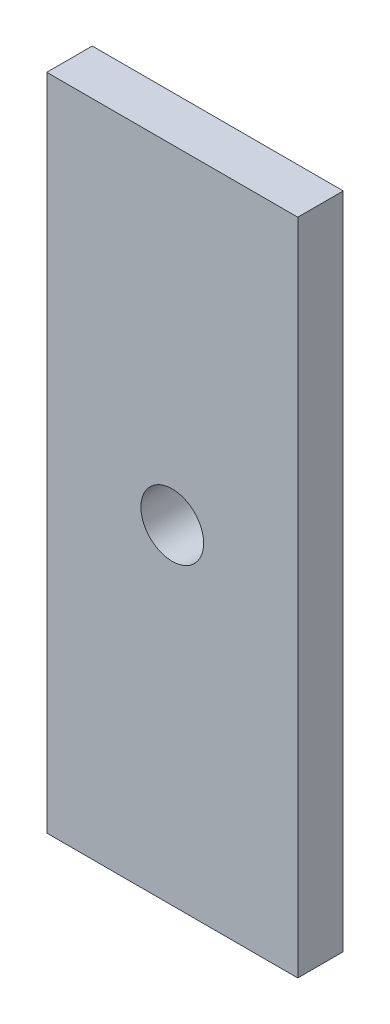
ISO-10303-21;
HEADER;
FILE_DESCRIPTION(('STEP AP214'),'2;1');
FILE_NAME('part.step','',(''),(''),'','','');
FILE_SCHEMA(('AUTOMOTIVE_DESIGN { 1 0 10303 214 1 1 1 1 }'));
ENDSEC;
DATA;
#1=APPLICATION_CONTEXT('core data for automotive mechanical design processes');
#2=APPLICATION_PROTOCOL_DEFINITION('international standard','automotive_design',2000,#1);
#3=PRODUCT_CONTEXT('',#1,'mechanical');
#4=PRODUCT('Part','Part','',(#3));
#5=PRODUCT_RELATED_PRODUCT_CATEGORY('part','',(#4));
#6=PRODUCT_DEFINITION_FORMATION('','',#4);
#7=PRODUCT_DEFINITION_CONTEXT('part definition',#1,'design');
#8=PRODUCT_DEFINITION('design','',#6,#7);
#9=PRODUCT_DEFINITION_SHAPE('','',#8);
#10=(LENGTH_UNIT() NAMED_UNIT(*) SI_UNIT(.MILLI.,.METRE.));
#11=(NAMED_UNIT(*) PLANE_ANGLE_UNIT() SI_UNIT($,.RADIAN.));
#12=(NAMED_UNIT(*) SI_UNIT($,.STERADIAN.) SOLID_ANGLE_UNIT());
#13=UNCERTAINTY_MEASURE_WITH_UNIT(LENGTH_MEASURE(1.E-05),#10,'distance_accuracy_value','');
#14=(GEOMETRIC_REPRESENTATION_CONTEXT(3) GLOBAL_UNCERTAINTY_ASSIGNED_CONTEXT((#13)) GLOBAL_UNIT_ASSIGNED_CONTEXT((#10,
#11,#12)) REPRESENTATION_CONTEXT('',''));
#15=CARTESIAN_POINT('',(0.,0.,0.));
#16=DIRECTION('',(0.,0.,1.));
#17=DIRECTION('',(1.,0.,0.));
#18=AXIS2_PLACEMENT_3D('',#15,#16,#17);
#19=CARTESIAN_POINT('',(0.,0.,5.8));
#20=DIRECTION('',(0.,0.,-1.));
#21=DIRECTION('',(-1.,0.,0.));
#22=AXIS2_PLACEMENT_3D('',#19,#20,#21);
#23=PLANE('',#22);
#24=DIRECTION('',(0.,-1.,0.));
#25=VECTOR('',#24,1.);
#26=CARTESIAN_POINT('',(0.,0.,5.8));
#27=LINE('',#26,#25);
#28=CARTESIAN_POINT('',(0.,84.,5.8));
#29=VERTEX_POINT('',#28);
#30=CARTESIAN_POINT('',(0.,0.,5.8));
#31=VERTEX_POINT('',#30);
#32=EDGE_CURVE('E87',#29,#31,#27,.T.);
#33=ORIENTED_EDGE('',*,*,#32,.T.);
#34=DIRECTION('',(1.,0.,0.));
#35=VECTOR('',#34,1.);
#36=CARTESIAN_POINT('',(0.,0.,5.8));
#37=LINE('',#36,#35);
#38=CARTESIAN_POINT('',(32.,0.,5.8));
#39=VERTEX_POINT('',#38);
#40=EDGE_CURVE('E82',#31,#39,#37,.T.);
#41=ORIENTED_EDGE('',*,*,#40,.T.);
#42=DIRECTION('',(0.,1.,0.));
#43=VECTOR('',#42,1.);
#44=CARTESIAN_POINT('',(32.,0.,5.8));
#45=LINE('',#44,#43);
#46=CARTESIAN_POINT('',(32.,84.,5.8));
#47=VERTEX_POINT('',#46);
#48=EDGE_CURVE('E85',#39,#47,#45,.T.);
#49=ORIENTED_EDGE('',*,*,#48,.T.);
#50=DIRECTION('',(-1.,0.,0.));
#51=VECTOR('',#50,1.);
#52=CARTESIAN_POINT('',(0.,84.,5.8));
#53=LINE('',#52,#51);
#54=EDGE_CURVE('E52',#47,#29,#53,.T.);
#55=ORIENTED_EDGE('',*,*,#54,.T.);
#56=EDGE_LOOP('',(#33,#41,#49,#55));
#57=FACE_BOUND('',#56,.T.);
#58=CARTESIAN_POINT('',(16.,42.,5.8));
#59=DIRECTION('',(0.,0.,1.));
#60=DIRECTION('',(1.,0.,0.));
#61=AXIS2_PLACEMENT_3D('',#58,#59,#60);
#62=CIRCLE('',#61,4.);
#63=CARTESIAN_POINT('',(20.,42.,5.8));
#64=VERTEX_POINT('',#63);
#65=EDGE_CURVE('E102',#64,#64,#62,.T.);
#66=ORIENTED_EDGE('',*,*,#65,.F.);
#67=EDGE_LOOP('',(#66));
#68=FACE_BOUND('',#67,.T.);
#69=ADVANCED_FACE('F35',(#57,#68),#23,.F.);
#70=CARTESIAN_POINT('',(0.,0.,0.));
#71=DIRECTION('',(0.,0.,-1.));
#72=DIRECTION('',(-1.,0.,0.));
#73=AXIS2_PLACEMENT_3D('',#70,#71,#72);
#74=PLANE('',#73);
#75=DIRECTION('',(0.,-1.,0.));
#76=VECTOR('',#75,1.);
#77=CARTESIAN_POINT('',(0.,0.,0.));
#78=LINE('',#77,#76);
#79=CARTESIAN_POINT('',(0.,84.,0.));
#80=VERTEX_POINT('',#79);
#81=CARTESIAN_POINT('',(0.,0.,0.));
#82=VERTEX_POINT('',#81);
#83=EDGE_CURVE('E99',#80,#82,#78,.T.);
#84=ORIENTED_EDGE('',*,*,#83,.F.);
#85=DIRECTION('',(-1.,0.,0.));
#86=VECTOR('',#85,1.);
#87=CARTESIAN_POINT('',(0.,84.,0.));
#88=LINE('',#87,#86);
#89=CARTESIAN_POINT('',(32.,84.,0.));
#90=VERTEX_POINT('',#89);
#91=EDGE_CURVE('E75',#90,#80,#88,.T.);
#92=ORIENTED_EDGE('',*,*,#91,.F.);
#93=DIRECTION('',(0.,1.,0.));
#94=VECTOR('',#93,1.);
#95=CARTESIAN_POINT('',(32.,0.,0.));
#96=LINE('',#95,#94);
#97=CARTESIAN_POINT('',(32.,0.,0.));
#98=VERTEX_POINT('',#97);
#99=EDGE_CURVE('E69',#98,#90,#96,.T.);
#100=ORIENTED_EDGE('',*,*,#99,.F.);
#101=DIRECTION('',(1.,0.,0.));
#102=VECTOR('',#101,1.);
#103=CARTESIAN_POINT('',(0.,0.,0.));
#104=LINE('',#103,#102);
#105=EDGE_CURVE('E91',#82,#98,#104,.T.);
#106=ORIENTED_EDGE('',*,*,#105,.F.);
#107=EDGE_LOOP('',(#84,#92,#100,#106));
#108=FACE_BOUND('',#107,.T.);
#109=CARTESIAN_POINT('',(16.,42.,0.));
#110=DIRECTION('',(0.,0.,1.));
#111=DIRECTION('',(1.,0.,0.));
#112=AXIS2_PLACEMENT_3D('',#109,#110,#111);
#113=CIRCLE('',#112,4.);
#114=CARTESIAN_POINT('',(20.,42.,0.));
#115=VERTEX_POINT('',#114);
#116=EDGE_CURVE('E114',#115,#115,#113,.T.);
#117=ORIENTED_EDGE('',*,*,#116,.T.);
#118=EDGE_LOOP('',(#117));
#119=FACE_BOUND('',#118,.T.);
#120=ADVANCED_FACE('F110',(#108,#119),#74,.T.);
#121=CARTESIAN_POINT('',(0.,0.,5.8));
#122=DIRECTION('',(1.,0.,0.));
#123=DIRECTION('',(0.,0.,-1.));
#124=AXIS2_PLACEMENT_3D('',#121,#122,#123);
#125=PLANE('',#124);
#126=ORIENTED_EDGE('',*,*,#83,.T.);
#127=DIRECTION('',(0.,0.,-1.));
#128=VECTOR('',#127,1.);
#129=CARTESIAN_POINT('',(0.,0.,5.8));
#130=LINE('',#129,#128);
#131=EDGE_CURVE('E11',#31,#82,#130,.T.);
#132=ORIENTED_EDGE('',*,*,#131,.F.);
#133=ORIENTED_EDGE('',*,*,#32,.F.);
#134=DIRECTION('',(0.,0.,-1.));
#135=VECTOR('',#134,1.);
#136=CARTESIAN_POINT('',(0.,84.,5.8));
#137=LINE('',#136,#135);
#138=EDGE_CURVE('E95',#29,#80,#137,.T.);
#139=ORIENTED_EDGE('',*,*,#138,.T.);
#140=EDGE_LOOP('',(#126,#132,#133,#139));
#141=FACE_BOUND('',#140,.T.);
#142=ADVANCED_FACE('F37',(#141),#125,.F.);
#143=CARTESIAN_POINT('',(0.,0.,5.8));
#144=DIRECTION('',(0.,1.,0.));
#145=DIRECTION('',(0.,0.,1.));
#146=AXIS2_PLACEMENT_3D('',#143,#144,#145);
#147=PLANE('',#146);
#148=ORIENTED_EDGE('',*,*,#105,.T.);
#149=DIRECTION('',(0.,0.,-1.));
#150=VECTOR('',#149,1.);
#151=CARTESIAN_POINT('',(32.,0.,5.8));
#152=LINE('',#151,#150);
#153=EDGE_CURVE('E44',#39,#98,#152,.T.);
#154=ORIENTED_EDGE('',*,*,#153,.F.);
#155=ORIENTED_EDGE('',*,*,#40,.F.);
#156=ORIENTED_EDGE('',*,*,#131,.T.);
#157=EDGE_LOOP('',(#148,#154,#155,#156));
#158=FACE_BOUND('',#157,.T.);
#159=ADVANCED_FACE('F90',(#158),#147,.F.);
#160=CARTESIAN_POINT('',(32.,0.,5.8));
#161=DIRECTION('',(-1.,0.,0.));
#162=DIRECTION('',(0.,0.,1.));
#163=AXIS2_PLACEMENT_3D('',#160,#161,#162);
#164=PLANE('',#163);
#165=ORIENTED_EDGE('',*,*,#99,.T.);
#166=DIRECTION('',(0.,0.,-1.));
#167=VECTOR('',#166,1.);
#168=CARTESIAN_POINT('',(32.,84.,5.8));
#169=LINE('',#168,#167);
#170=EDGE_CURVE('E92',#47,#90,#169,.T.);
#171=ORIENTED_EDGE('',*,*,#170,.F.);
#172=ORIENTED_EDGE('',*,*,#48,.F.);
#173=ORIENTED_EDGE('',*,*,#153,.T.);
#174=EDGE_LOOP('',(#165,#171,#172,#173));
#175=FACE_BOUND('',#174,.T.);
#176=ADVANCED_FACE('F93',(#175),#164,.F.);
#177=CARTESIAN_POINT('',(0.,84.,5.8));
#178=DIRECTION('',(0.,-1.,0.));
#179=DIRECTION('',(0.,0.,-1.));
#180=AXIS2_PLACEMENT_3D('',#177,#178,#179);
#181=PLANE('',#180);
#182=ORIENTED_EDGE('',*,*,#91,.T.);
#183=ORIENTED_EDGE('',*,*,#138,.F.);
#184=ORIENTED_EDGE('',*,*,#54,.F.);
#185=ORIENTED_EDGE('',*,*,#170,.T.);
#186=EDGE_LOOP('',(#182,#183,#184,#185));
#187=FACE_BOUND('',#186,.T.);
#188=ADVANCED_FACE('F107',(#187),#181,.F.);
#189=CARTESIAN_POINT('',(16.,42.,5.8));
#190=DIRECTION('',(0.,0.,-1.));
#191=DIRECTION('',(-1.,0.,0.));
#192=AXIS2_PLACEMENT_3D('',#189,#190,#191);
#193=CYLINDRICAL_SURFACE('',#192,4.);
#194=ORIENTED_EDGE('',*,*,#65,.T.);
#195=EDGE_LOOP('',(#194));
#196=FACE_BOUND('',#195,.T.);
#197=ORIENTED_EDGE('',*,*,#116,.F.);
#198=EDGE_LOOP('',(#197));
#199=FACE_BOUND('',#198,.T.);
#200=ADVANCED_FACE('F120',(#196,#199),#193,.F.);
#201=CLOSED_SHELL('',(#69,#120,#142,#159,#176,#188,#200));
#202=MANIFOLD_SOLID_BREP('B2',#201);
#203=ADVANCED_BREP_SHAPE_REPRESENTATION('',(#18,#202),#14);
#204=SHAPE_DEFINITION_REPRESENTATION(#9,#203);
ENDSEC;
END-ISO-10303-21;
